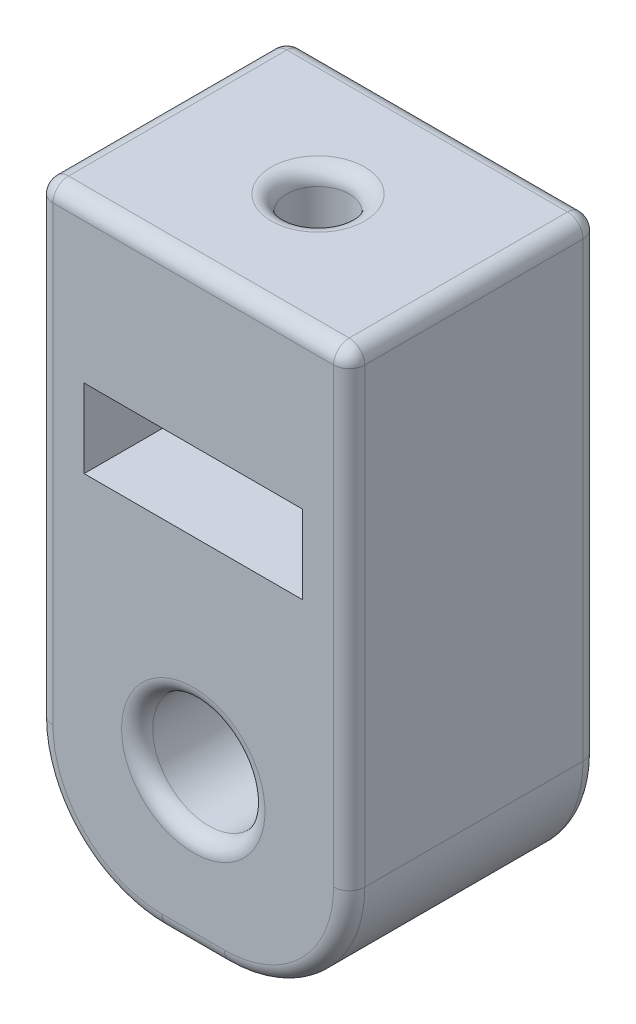
ISO-10303-21;
HEADER;
FILE_DESCRIPTION(('STEP AP214'),'2;1');
FILE_NAME('part.step','',(''),(''),'','','');
FILE_SCHEMA(('AUTOMOTIVE_DESIGN { 1 0 10303 214 1 1 1 1 }'));
ENDSEC;
DATA;
#1=APPLICATION_CONTEXT('core data for automotive mechanical design processes');
#2=APPLICATION_PROTOCOL_DEFINITION('international standard','automotive_design',2000,#1);
#3=PRODUCT_CONTEXT('',#1,'mechanical');
#4=PRODUCT('Part','Part','',(#3));
#5=PRODUCT_RELATED_PRODUCT_CATEGORY('part','',(#4));
#6=PRODUCT_DEFINITION_FORMATION('','',#4);
#7=PRODUCT_DEFINITION_CONTEXT('part definition',#1,'design');
#8=PRODUCT_DEFINITION('design','',#6,#7);
#9=PRODUCT_DEFINITION_SHAPE('','',#8);
#10=(LENGTH_UNIT() NAMED_UNIT(*) SI_UNIT(.MILLI.,.METRE.));
#11=(NAMED_UNIT(*) PLANE_ANGLE_UNIT() SI_UNIT($,.RADIAN.));
#12=(NAMED_UNIT(*) SI_UNIT($,.STERADIAN.) SOLID_ANGLE_UNIT());
#13=UNCERTAINTY_MEASURE_WITH_UNIT(LENGTH_MEASURE(1.E-05),#10,'distance_accuracy_value','');
#14=(GEOMETRIC_REPRESENTATION_CONTEXT(3) GLOBAL_UNCERTAINTY_ASSIGNED_CONTEXT((#13)) GLOBAL_UNIT_ASSIGNED_CONTEXT((#10,
#11,#12)) REPRESENTATION_CONTEXT('',''));
#15=CARTESIAN_POINT('',(0.,0.,0.));
#16=DIRECTION('',(0.,0.,1.));
#17=DIRECTION('',(1.,0.,0.));
#18=AXIS2_PLACEMENT_3D('',#15,#16,#17);
#19=CARTESIAN_POINT('',(6.35,8.89,5.08));
#20=DIRECTION('',(0.,1.,0.));
#21=DIRECTION('',(0.,0.,1.));
#22=AXIS2_PLACEMENT_3D('',#19,#20,#21);
#23=CYLINDRICAL_SURFACE('',#22,1.27);
#24=CARTESIAN_POINT('',(6.35,17.78,5.08));
#25=DIRECTION('',(0.,1.,0.));
#26=DIRECTION('',(0.,0.,1.));
#27=AXIS2_PLACEMENT_3D('',#24,#25,#26);
#28=CIRCLE('',#27,1.27);
#29=CARTESIAN_POINT('',(6.35,17.78,6.35));
#30=VERTEX_POINT('',#29);
#31=EDGE_CURVE('E46',#30,#30,#28,.F.);
#32=CARTESIAN_POINT('',(6.35,23.495,5.08));
#33=DIRECTION('',(0.,-1.,0.));
#34=DIRECTION('',(0.,0.,-1.));
#35=AXIS2_PLACEMENT_3D('',#32,#33,#34);
#36=CIRCLE('',#35,1.27);
#37=CARTESIAN_POINT('',(6.35,23.495,6.35));
#38=VERTEX_POINT('',#37);
#39=EDGE_CURVE('E326',#38,#38,#36,.F.);
#40=CARTESIAN_POINT('',(6.35,17.78,6.35));
#41=CARTESIAN_POINT('',(6.35,17.83953125,6.35));
#42=CARTESIAN_POINT('',(6.35,17.8990625,6.35));
#43=CARTESIAN_POINT('',(6.35,18.018125,6.35));
#44=CARTESIAN_POINT('',(6.35,18.07765625,6.35));
#45=CARTESIAN_POINT('',(6.35,18.19671875,6.35));
#46=CARTESIAN_POINT('',(6.35,18.25625,6.35));
#47=CARTESIAN_POINT('',(6.35,18.3753125,6.35));
#48=CARTESIAN_POINT('',(6.35,18.43484375,6.35));
#49=CARTESIAN_POINT('',(6.35,18.55390625,6.35));
#50=CARTESIAN_POINT('',(6.35,18.6134375,6.35));
#51=CARTESIAN_POINT('',(6.35,18.7325,6.35));
#52=CARTESIAN_POINT('',(6.35,18.79203125,6.35));
#53=CARTESIAN_POINT('',(6.35,18.91109375,6.35));
#54=CARTESIAN_POINT('',(6.35,18.970625,6.35));
#55=CARTESIAN_POINT('',(6.35,19.0896875,6.35));
#56=CARTESIAN_POINT('',(6.35,19.14921875,6.35));
#57=CARTESIAN_POINT('',(6.35,19.26828125,6.35));
#58=CARTESIAN_POINT('',(6.35,19.3278125,6.35));
#59=CARTESIAN_POINT('',(6.35,19.446875,6.35));
#60=CARTESIAN_POINT('',(6.35,19.50640625,6.35));
#61=CARTESIAN_POINT('',(6.35,19.62546875,6.35));
#62=CARTESIAN_POINT('',(6.35,19.685,6.35));
#63=CARTESIAN_POINT('',(6.35,19.8040625,6.35));
#64=CARTESIAN_POINT('',(6.35,19.86359375,6.35));
#65=CARTESIAN_POINT('',(6.35,19.98265625,6.35));
#66=CARTESIAN_POINT('',(6.35,20.0421875,6.35));
#67=CARTESIAN_POINT('',(6.35,20.16125,6.35));
#68=CARTESIAN_POINT('',(6.35,20.22078125,6.35));
#69=CARTESIAN_POINT('',(6.35,20.33984375,6.35));
#70=CARTESIAN_POINT('',(6.35,20.399375,6.35));
#71=CARTESIAN_POINT('',(6.35,20.5184375,6.35));
#72=CARTESIAN_POINT('',(6.35,20.57796875,6.35));
#73=CARTESIAN_POINT('',(6.35,20.69703125,6.35));
#74=CARTESIAN_POINT('',(6.35,20.7565625,6.35));
#75=CARTESIAN_POINT('',(6.35,20.875625,6.35));
#76=CARTESIAN_POINT('',(6.35,20.93515625,6.35));
#77=CARTESIAN_POINT('',(6.35,21.05421875,6.35));
#78=CARTESIAN_POINT('',(6.35,21.11375,6.35));
#79=CARTESIAN_POINT('',(6.35,21.2328125,6.35));
#80=CARTESIAN_POINT('',(6.35,21.29234375,6.35));
#81=CARTESIAN_POINT('',(6.35,21.41140625,6.35));
#82=CARTESIAN_POINT('',(6.35,21.4709375,6.35));
#83=CARTESIAN_POINT('',(6.35,21.59,6.35));
#84=CARTESIAN_POINT('',(6.35,21.64953125,6.35));
#85=CARTESIAN_POINT('',(6.35,21.76859375,6.35));
#86=CARTESIAN_POINT('',(6.35,21.828125,6.35));
#87=CARTESIAN_POINT('',(6.35,21.9471875,6.35));
#88=CARTESIAN_POINT('',(6.35,22.00671875,6.35));
#89=CARTESIAN_POINT('',(6.35,22.12578125,6.35));
#90=CARTESIAN_POINT('',(6.35,22.1853125,6.35));
#91=CARTESIAN_POINT('',(6.35,22.304375,6.35));
#92=CARTESIAN_POINT('',(6.35,22.36390625,6.35));
#93=CARTESIAN_POINT('',(6.35,22.48296875,6.35));
#94=CARTESIAN_POINT('',(6.35,22.5425,6.35));
#95=CARTESIAN_POINT('',(6.35,22.6615625,6.35));
#96=CARTESIAN_POINT('',(6.35,22.72109375,6.35));
#97=CARTESIAN_POINT('',(6.35,22.84015625,6.35));
#98=CARTESIAN_POINT('',(6.35,22.8996875,6.35));
#99=CARTESIAN_POINT('',(6.35,23.01875,6.35));
#100=CARTESIAN_POINT('',(6.35,23.07828125,6.35));
#101=CARTESIAN_POINT('',(6.35,23.19734375,6.35));
#102=CARTESIAN_POINT('',(6.35,23.256875,6.35));
#103=CARTESIAN_POINT('',(6.35,23.3759375,6.35));
#104=CARTESIAN_POINT('',(6.35,23.43546875,6.35));
#105=CARTESIAN_POINT('',(6.35,23.495,6.35));
#106=B_SPLINE_CURVE_WITH_KNOTS('',3,(#40,#41,#42,#43,#44,#45,#46,#47,#48,#49,#50,#51,#52,#53,
#54,#55,#56,#57,#58,#59,#60,#61,#62,#63,#64,#65,#66,#67,#68,#69,#70,#71,#72,#73,#74,#75,#76,#77,
#78,#79,#80,#81,#82,#83,#84,#85,#86,#87,#88,#89,#90,#91,#92,#93,#94,#95,#96,#97,#98,#99,#100,
#101,#102,#103,#104,#105),.UNSPECIFIED.,.F.,.F.,(4,2,2,2,2,2,2,2,2,2,2,2,2,2,2,2,2,2,2,2,2,2,2,
2,2,2,2,2,2,2,2,2,4),(0.,0.178593750000001,0.357187499999998,0.535781250000002,0.714375,
0.892968750000001,1.0715625,1.25015625,1.42875,1.60734375,1.7859375,1.96453125,2.143125,
2.32171875,2.5003125,2.67890625,2.8575,3.03609375,3.2146875,3.39328125,3.571875,3.75046875,
3.9290625,4.10765625,4.28625,4.46484375,4.6434375,4.82203125,5.000625,5.17921875,
5.35781250000001,5.53640625,5.71500000000001),.UNSPECIFIED.);
#107=EDGE_CURVE('BSEAM42',#30,#38,#106,.T.);
#108=ORIENTED_EDGE('',*,*,#31,.T.);
#109=ORIENTED_EDGE('',*,*,#39,.T.);
#110=ORIENTED_EDGE('',*,*,#107,.T.);
#111=ORIENTED_EDGE('',*,*,#107,.F.);
#112=EDGE_LOOP('',(#108,#110,#109,#111));
#113=FACE_BOUND('',#112,.T.);
#114=ADVANCED_FACE('F42',(#113),#23,.F.);
#115=CARTESIAN_POINT('',(0.,0.,10.16));
#116=DIRECTION('',(0.,0.,-1.));
#117=DIRECTION('',(-1.,0.,0.));
#118=AXIS2_PLACEMENT_3D('',#115,#116,#117);
#119=PLANE('',#118);
#120=DIRECTION('',(1.,0.,0.));
#121=VECTOR('',#120,1.);
#122=CARTESIAN_POINT('',(10.795,17.78,10.16));
#123=LINE('',#122,#121);
#124=CARTESIAN_POINT('',(1.905,17.78,10.16));
#125=VERTEX_POINT('',#124);
#126=CARTESIAN_POINT('',(10.795,17.78,10.16));
#127=VERTEX_POINT('',#126);
#128=EDGE_CURVE('E179',#125,#127,#123,.T.);
#129=ORIENTED_EDGE('',*,*,#128,.T.);
#130=DIRECTION('',(0.,-1.,0.));
#131=VECTOR('',#130,1.);
#132=CARTESIAN_POINT('',(10.795,17.78,10.16));
#133=LINE('',#132,#131);
#134=CARTESIAN_POINT('',(10.795,14.58468,10.16));
#135=VERTEX_POINT('',#134);
#136=EDGE_CURVE('E172',#127,#135,#133,.T.);
#137=ORIENTED_EDGE('',*,*,#136,.T.);
#138=DIRECTION('',(-1.,0.,0.));
#139=VECTOR('',#138,1.);
#140=CARTESIAN_POINT('',(10.795,14.58468,10.16));
#141=LINE('',#140,#139);
#142=CARTESIAN_POINT('',(1.905,14.58468,10.16));
#143=VERTEX_POINT('',#142);
#144=EDGE_CURVE('E182',#135,#143,#141,.T.);
#145=ORIENTED_EDGE('',*,*,#144,.T.);
#146=DIRECTION('',(0.,1.,0.));
#147=VECTOR('',#146,1.);
#148=CARTESIAN_POINT('',(1.905,17.78,10.16));
#149=LINE('',#148,#147);
#150=EDGE_CURVE('E60',#143,#125,#149,.T.);
#151=ORIENTED_EDGE('',*,*,#150,.T.);
#152=EDGE_LOOP('',(#129,#137,#145,#151));
#153=FACE_BOUND('',#152,.T.);
#154=CARTESIAN_POINT('',(6.35,6.35,10.16));
#155=DIRECTION('',(0.,0.,-1.));
#156=DIRECTION('',(-1.,0.,0.));
#157=AXIS2_PLACEMENT_3D('',#154,#155,#156);
#158=CIRCLE('',#157,2.921);
#159=CARTESIAN_POINT('',(3.429,6.35,10.16));
#160=VERTEX_POINT('',#159);
#161=EDGE_CURVE('E11',#160,#160,#158,.T.);
#162=ORIENTED_EDGE('',*,*,#161,.T.);
#163=EDGE_LOOP('',(#162));
#164=FACE_BOUND('',#163,.T.);
#165=DIRECTION('',(0.,-1.,0.));
#166=VECTOR('',#165,1.);
#167=CARTESIAN_POINT('',(0.635,0.,10.16));
#168=LINE('',#167,#166);
#169=CARTESIAN_POINT('',(0.635,23.495,10.16));
#170=VERTEX_POINT('',#169);
#171=CARTESIAN_POINT('',(0.635,5.08,10.16));
#172=VERTEX_POINT('',#171);
#173=EDGE_CURVE('E342',#170,#172,#168,.T.);
#174=ORIENTED_EDGE('',*,*,#173,.T.);
#175=CARTESIAN_POINT('',(5.08,5.08,10.16));
#176=DIRECTION('',(0.,0.,-1.));
#177=DIRECTION('',(-1.,0.,0.));
#178=AXIS2_PLACEMENT_3D('',#175,#176,#177);
#179=CIRCLE('',#178,4.445);
#180=CARTESIAN_POINT('',(5.08,0.635,10.16));
#181=VERTEX_POINT('',#180);
#182=EDGE_CURVE('E52',#172,#181,#179,.F.);
#183=ORIENTED_EDGE('',*,*,#182,.T.);
#184=DIRECTION('',(1.,0.,0.));
#185=VECTOR('',#184,1.);
#186=CARTESIAN_POINT('',(0.,0.635,10.16));
#187=LINE('',#186,#185);
#188=CARTESIAN_POINT('',(7.62,0.635,10.16));
#189=VERTEX_POINT('',#188);
#190=EDGE_CURVE('E330',#181,#189,#187,.T.);
#191=ORIENTED_EDGE('',*,*,#190,.T.);
#192=CARTESIAN_POINT('',(7.62,5.08,10.16));
#193=DIRECTION('',(0.,0.,-1.));
#194=DIRECTION('',(-1.,0.,0.));
#195=AXIS2_PLACEMENT_3D('',#192,#193,#194);
#196=CIRCLE('',#195,4.445);
#197=CARTESIAN_POINT('',(12.065,5.08,10.16));
#198=VERTEX_POINT('',#197);
#199=EDGE_CURVE('E333',#189,#198,#196,.F.);
#200=ORIENTED_EDGE('',*,*,#199,.T.);
#201=DIRECTION('',(0.,1.,0.));
#202=VECTOR('',#201,1.);
#203=CARTESIAN_POINT('',(12.065,0.,10.16));
#204=LINE('',#203,#202);
#205=CARTESIAN_POINT('',(12.065,23.495,10.16));
#206=VERTEX_POINT('',#205);
#207=EDGE_CURVE('E336',#198,#206,#204,.T.);
#208=ORIENTED_EDGE('',*,*,#207,.T.);
#209=DIRECTION('',(-1.,0.,0.));
#210=VECTOR('',#209,1.);
#211=CARTESIAN_POINT('',(0.,23.495,10.16));
#212=LINE('',#211,#210);
#213=EDGE_CURVE('E339',#206,#170,#212,.T.);
#214=ORIENTED_EDGE('',*,*,#213,.T.);
#215=EDGE_LOOP('',(#174,#183,#191,#200,#208,#214));
#216=FACE_BOUND('',#215,.T.);
#217=ADVANCED_FACE('F188',(#153,#164,#216),#119,.F.);
#218=CARTESIAN_POINT('',(0.,0.,0.));
#219=DIRECTION('',(0.,0.,-1.));
#220=DIRECTION('',(-1.,0.,0.));
#221=AXIS2_PLACEMENT_3D('',#218,#219,#220);
#222=PLANE('',#221);
#223=DIRECTION('',(0.,-1.,0.));
#224=VECTOR('',#223,1.);
#225=CARTESIAN_POINT('',(10.795,17.78,0.));
#226=LINE('',#225,#224);
#227=CARTESIAN_POINT('',(10.795,17.78,0.));
#228=VERTEX_POINT('',#227);
#229=CARTESIAN_POINT('',(10.795,14.58468,0.));
#230=VERTEX_POINT('',#229);
#231=EDGE_CURVE('E68',#228,#230,#226,.T.);
#232=ORIENTED_EDGE('',*,*,#231,.F.);
#233=DIRECTION('',(1.,0.,0.));
#234=VECTOR('',#233,1.);
#235=CARTESIAN_POINT('',(10.795,17.78,0.));
#236=LINE('',#235,#234);
#237=CARTESIAN_POINT('',(1.905,17.78,0.));
#238=VERTEX_POINT('',#237);
#239=EDGE_CURVE('E192',#238,#228,#236,.T.);
#240=ORIENTED_EDGE('',*,*,#239,.F.);
#241=DIRECTION('',(0.,1.,0.));
#242=VECTOR('',#241,1.);
#243=CARTESIAN_POINT('',(1.905,17.78,0.));
#244=LINE('',#243,#242);
#245=CARTESIAN_POINT('',(1.905,14.58468,0.));
#246=VERTEX_POINT('',#245);
#247=EDGE_CURVE('E196',#246,#238,#244,.T.);
#248=ORIENTED_EDGE('',*,*,#247,.F.);
#249=DIRECTION('',(-1.,0.,0.));
#250=VECTOR('',#249,1.);
#251=CARTESIAN_POINT('',(10.795,14.58468,0.));
#252=LINE('',#251,#250);
#253=EDGE_CURVE('E205',#230,#246,#252,.T.);
#254=ORIENTED_EDGE('',*,*,#253,.F.);
#255=EDGE_LOOP('',(#232,#240,#248,#254));
#256=FACE_BOUND('',#255,.T.);
#257=CARTESIAN_POINT('',(6.35,6.35,0.));
#258=DIRECTION('',(0.,0.,-1.));
#259=DIRECTION('',(-1.,0.,0.));
#260=AXIS2_PLACEMENT_3D('',#257,#258,#259);
#261=CIRCLE('',#260,2.921);
#262=CARTESIAN_POINT('',(3.429,6.35,0.));
#263=VERTEX_POINT('',#262);
#264=EDGE_CURVE('E260',#263,#263,#261,.F.);
#265=ORIENTED_EDGE('',*,*,#264,.T.);
#266=EDGE_LOOP('',(#265));
#267=FACE_BOUND('',#266,.T.);
#268=CARTESIAN_POINT('',(5.08,5.08,0.));
#269=DIRECTION('',(0.,0.,-1.));
#270=DIRECTION('',(-1.,0.,0.));
#271=AXIS2_PLACEMENT_3D('',#268,#269,#270);
#272=CIRCLE('',#271,4.445);
#273=CARTESIAN_POINT('',(5.08,0.635,0.));
#274=VERTEX_POINT('',#273);
#275=CARTESIAN_POINT('',(0.635,5.08,0.));
#276=VERTEX_POINT('',#275);
#277=EDGE_CURVE('E253',#274,#276,#272,.T.);
#278=ORIENTED_EDGE('',*,*,#277,.T.);
#279=DIRECTION('',(0.,-1.,0.));
#280=VECTOR('',#279,1.);
#281=CARTESIAN_POINT('',(0.635,24.13,0.));
#282=LINE('',#281,#280);
#283=CARTESIAN_POINT('',(0.635,23.495,0.));
#284=VERTEX_POINT('',#283);
#285=EDGE_CURVE('E256',#276,#284,#282,.F.);
#286=ORIENTED_EDGE('',*,*,#285,.T.);
#287=DIRECTION('',(-1.,0.,0.));
#288=VECTOR('',#287,1.);
#289=CARTESIAN_POINT('',(12.7,23.495,0.));
#290=LINE('',#289,#288);
#291=CARTESIAN_POINT('',(12.065,23.495,0.));
#292=VERTEX_POINT('',#291);
#293=EDGE_CURVE('E241',#284,#292,#290,.F.);
#294=ORIENTED_EDGE('',*,*,#293,.T.);
#295=DIRECTION('',(0.,1.,0.));
#296=VECTOR('',#295,1.);
#297=CARTESIAN_POINT('',(12.065,5.08,0.));
#298=LINE('',#297,#296);
#299=CARTESIAN_POINT('',(12.065,5.08,0.));
#300=VERTEX_POINT('',#299);
#301=EDGE_CURVE('E244',#292,#300,#298,.F.);
#302=ORIENTED_EDGE('',*,*,#301,.T.);
#303=CARTESIAN_POINT('',(7.62,5.08,0.));
#304=DIRECTION('',(0.,0.,-1.));
#305=DIRECTION('',(-1.,0.,0.));
#306=AXIS2_PLACEMENT_3D('',#303,#304,#305);
#307=CIRCLE('',#306,4.445);
#308=CARTESIAN_POINT('',(7.62,0.635,0.));
#309=VERTEX_POINT('',#308);
#310=EDGE_CURVE('E247',#300,#309,#307,.T.);
#311=ORIENTED_EDGE('',*,*,#310,.T.);
#312=DIRECTION('',(1.,0.,0.));
#313=VECTOR('',#312,1.);
#314=CARTESIAN_POINT('',(5.08,0.635,0.));
#315=LINE('',#314,#313);
#316=EDGE_CURVE('E250',#309,#274,#315,.F.);
#317=ORIENTED_EDGE('',*,*,#316,.T.);
#318=EDGE_LOOP('',(#278,#286,#294,#302,#311,#317));
#319=FACE_BOUND('',#318,.T.);
#320=ADVANCED_FACE('F451',(#256,#267,#319),#222,.T.);
#321=CARTESIAN_POINT('',(0.,0.,10.16));
#322=DIRECTION('',(1.,0.,0.));
#323=DIRECTION('',(0.,0.,-1.));
#324=AXIS2_PLACEMENT_3D('',#321,#322,#323);
#325=PLANE('',#324);
#326=DIRECTION('',(0.,0.,-1.));
#327=VECTOR('',#326,1.);
#328=CARTESIAN_POINT('',(0.,23.495,10.16));
#329=LINE('',#328,#327);
#330=CARTESIAN_POINT('',(0.,23.495,9.525));
#331=VERTEX_POINT('',#330);
#332=CARTESIAN_POINT('',(0.,23.495,0.635));
#333=VERTEX_POINT('',#332);
#334=EDGE_CURVE('E275',#331,#333,#329,.T.);
#335=ORIENTED_EDGE('',*,*,#334,.T.);
#336=DIRECTION('',(0.,-1.,0.));
#337=VECTOR('',#336,1.);
#338=CARTESIAN_POINT('',(0.,5.08,0.635));
#339=LINE('',#338,#337);
#340=CARTESIAN_POINT('',(0.,5.08,0.635));
#341=VERTEX_POINT('',#340);
#342=EDGE_CURVE('E278',#333,#341,#339,.T.);
#343=ORIENTED_EDGE('',*,*,#342,.T.);
#344=DIRECTION('',(0.,0.,-1.));
#345=VECTOR('',#344,1.);
#346=CARTESIAN_POINT('',(0.,5.08,10.16));
#347=LINE('',#346,#345);
#348=CARTESIAN_POINT('',(0.,5.08,9.525));
#349=VERTEX_POINT('',#348);
#350=EDGE_CURVE('E237',#341,#349,#347,.F.);
#351=ORIENTED_EDGE('',*,*,#350,.T.);
#352=DIRECTION('',(0.,-1.,0.));
#353=VECTOR('',#352,1.);
#354=CARTESIAN_POINT('',(0.,0.,9.525));
#355=LINE('',#354,#353);
#356=EDGE_CURVE('E272',#349,#331,#355,.F.);
#357=ORIENTED_EDGE('',*,*,#356,.T.);
#358=EDGE_LOOP('',(#335,#343,#351,#357));
#359=FACE_BOUND('',#358,.T.);
#360=ADVANCED_FACE('F776',(#359),#325,.F.);
#361=CARTESIAN_POINT('',(0.,0.,10.16));
#362=DIRECTION('',(0.,1.,0.));
#363=DIRECTION('',(0.,0.,1.));
#364=AXIS2_PLACEMENT_3D('',#361,#362,#363);
#365=PLANE('',#364);
#366=DIRECTION('',(0.,0.,-1.));
#367=VECTOR('',#366,1.);
#368=CARTESIAN_POINT('',(5.08,0.,10.16));
#369=LINE('',#368,#367);
#370=CARTESIAN_POINT('',(5.08,0.,9.525));
#371=VERTEX_POINT('',#370);
#372=CARTESIAN_POINT('',(5.08,0.,0.635));
#373=VERTEX_POINT('',#372);
#374=EDGE_CURVE('E229',#371,#373,#369,.T.);
#375=ORIENTED_EDGE('',*,*,#374,.T.);
#376=DIRECTION('',(1.,0.,0.));
#377=VECTOR('',#376,1.);
#378=CARTESIAN_POINT('',(7.62,0.,0.635));
#379=LINE('',#378,#377);
#380=CARTESIAN_POINT('',(7.62,0.,0.635));
#381=VERTEX_POINT('',#380);
#382=EDGE_CURVE('E291',#373,#381,#379,.T.);
#383=ORIENTED_EDGE('',*,*,#382,.T.);
#384=DIRECTION('',(0.,0.,-1.));
#385=VECTOR('',#384,1.);
#386=CARTESIAN_POINT('',(7.62,0.,10.16));
#387=LINE('',#386,#385);
#388=CARTESIAN_POINT('',(7.62,0.,9.525));
#389=VERTEX_POINT('',#388);
#390=EDGE_CURVE('E233',#381,#389,#387,.F.);
#391=ORIENTED_EDGE('',*,*,#390,.T.);
#392=DIRECTION('',(1.,0.,0.));
#393=VECTOR('',#392,1.);
#394=CARTESIAN_POINT('',(0.,0.,9.525));
#395=LINE('',#394,#393);
#396=EDGE_CURVE('E288',#389,#371,#395,.F.);
#397=ORIENTED_EDGE('',*,*,#396,.T.);
#398=EDGE_LOOP('',(#375,#383,#391,#397));
#399=FACE_BOUND('',#398,.T.);
#400=ADVANCED_FACE('F797',(#399),#365,.F.);
#401=CARTESIAN_POINT('',(12.7,0.,10.16));
#402=DIRECTION('',(-1.,0.,0.));
#403=DIRECTION('',(0.,0.,1.));
#404=AXIS2_PLACEMENT_3D('',#401,#402,#403);
#405=PLANE('',#404);
#406=DIRECTION('',(0.,0.,-1.));
#407=VECTOR('',#406,1.);
#408=CARTESIAN_POINT('',(12.7,5.08,10.16));
#409=LINE('',#408,#407);
#410=CARTESIAN_POINT('',(12.7,5.08,9.525));
#411=VERTEX_POINT('',#410);
#412=CARTESIAN_POINT('',(12.7,5.08,0.635));
#413=VERTEX_POINT('',#412);
#414=EDGE_CURVE('E224',#411,#413,#409,.T.);
#415=ORIENTED_EDGE('',*,*,#414,.T.);
#416=DIRECTION('',(0.,1.,0.));
#417=VECTOR('',#416,1.);
#418=CARTESIAN_POINT('',(12.7,24.13,0.635));
#419=LINE('',#418,#417);
#420=CARTESIAN_POINT('',(12.7,23.495,0.635));
#421=VERTEX_POINT('',#420);
#422=EDGE_CURVE('E306',#413,#421,#419,.T.);
#423=ORIENTED_EDGE('',*,*,#422,.T.);
#424=DIRECTION('',(0.,0.,-1.));
#425=VECTOR('',#424,1.);
#426=CARTESIAN_POINT('',(12.7,23.495,10.16));
#427=LINE('',#426,#425);
#428=CARTESIAN_POINT('',(12.7,23.495,9.525));
#429=VERTEX_POINT('',#428);
#430=EDGE_CURVE('E303',#421,#429,#427,.F.);
#431=ORIENTED_EDGE('',*,*,#430,.T.);
#432=DIRECTION('',(0.,1.,0.));
#433=VECTOR('',#432,1.);
#434=CARTESIAN_POINT('',(12.7,0.,9.525));
#435=LINE('',#434,#433);
#436=EDGE_CURVE('E300',#429,#411,#435,.F.);
#437=ORIENTED_EDGE('',*,*,#436,.T.);
#438=EDGE_LOOP('',(#415,#423,#431,#437));
#439=FACE_BOUND('',#438,.T.);
#440=ADVANCED_FACE('F806',(#439),#405,.F.);
#441=CARTESIAN_POINT('',(0.,24.13,10.16));
#442=DIRECTION('',(0.,-1.,0.));
#443=DIRECTION('',(0.,0.,-1.));
#444=AXIS2_PLACEMENT_3D('',#441,#442,#443);
#445=PLANE('',#444);
#446=CARTESIAN_POINT('',(6.35,24.13,5.08));
#447=DIRECTION('',(0.,-1.,0.));
#448=DIRECTION('',(0.,0.,-1.));
#449=AXIS2_PLACEMENT_3D('',#446,#447,#448);
#450=CIRCLE('',#449,1.905);
#451=CARTESIAN_POINT('',(6.35,24.13,3.175));
#452=VERTEX_POINT('',#451);
#453=EDGE_CURVE('E322',#452,#452,#450,.T.);
#454=ORIENTED_EDGE('',*,*,#453,.T.);
#455=EDGE_LOOP('',(#454));
#456=FACE_BOUND('',#455,.T.);
#457=DIRECTION('',(0.,0.,-1.));
#458=VECTOR('',#457,1.);
#459=CARTESIAN_POINT('',(12.065,24.13,10.16));
#460=LINE('',#459,#458);
#461=CARTESIAN_POINT('',(12.065,24.13,9.525));
#462=VERTEX_POINT('',#461);
#463=CARTESIAN_POINT('',(12.065,24.13,0.635));
#464=VERTEX_POINT('',#463);
#465=EDGE_CURVE('E315',#462,#464,#460,.T.);
#466=ORIENTED_EDGE('',*,*,#465,.T.);
#467=DIRECTION('',(-1.,0.,0.));
#468=VECTOR('',#467,1.);
#469=CARTESIAN_POINT('',(0.,24.13,0.635));
#470=LINE('',#469,#468);
#471=CARTESIAN_POINT('',(0.635,24.13,0.635));
#472=VERTEX_POINT('',#471);
#473=EDGE_CURVE('E319',#464,#472,#470,.T.);
#474=ORIENTED_EDGE('',*,*,#473,.T.);
#475=DIRECTION('',(0.,0.,-1.));
#476=VECTOR('',#475,1.);
#477=CARTESIAN_POINT('',(0.635,24.13,10.16));
#478=LINE('',#477,#476);
#479=CARTESIAN_POINT('',(0.635,24.13,9.525));
#480=VERTEX_POINT('',#479);
#481=EDGE_CURVE('E312',#472,#480,#478,.F.);
#482=ORIENTED_EDGE('',*,*,#481,.T.);
#483=DIRECTION('',(-1.,0.,0.));
#484=VECTOR('',#483,1.);
#485=CARTESIAN_POINT('',(0.,24.13,9.525));
#486=LINE('',#485,#484);
#487=EDGE_CURVE('E309',#480,#462,#486,.F.);
#488=ORIENTED_EDGE('',*,*,#487,.T.);
#489=EDGE_LOOP('',(#466,#474,#482,#488));
#490=FACE_BOUND('',#489,.T.);
#491=ADVANCED_FACE('F816',(#456,#490),#445,.F.);
#492=CARTESIAN_POINT('',(6.35,6.35,10.16));
#493=DIRECTION('',(0.,0.,-1.));
#494=DIRECTION('',(-1.,0.,0.));
#495=AXIS2_PLACEMENT_3D('',#492,#493,#494);
#496=CYLINDRICAL_SURFACE('',#495,2.286);
#497=CARTESIAN_POINT('',(6.35,6.35,0.635));
#498=DIRECTION('',(0.,0.,-1.));
#499=DIRECTION('',(-1.,0.,0.));
#500=AXIS2_PLACEMENT_3D('',#497,#498,#499);
#501=CIRCLE('',#500,2.286);
#502=CARTESIAN_POINT('',(4.064,6.35,0.635));
#503=VERTEX_POINT('',#502);
#504=EDGE_CURVE('E268',#503,#503,#501,.T.);
#505=ORIENTED_EDGE('',*,*,#504,.T.);
#506=EDGE_LOOP('',(#505));
#507=FACE_BOUND('',#506,.T.);
#508=CARTESIAN_POINT('',(6.35,6.35,9.525));
#509=DIRECTION('',(0.,0.,-1.));
#510=DIRECTION('',(-1.,0.,0.));
#511=AXIS2_PLACEMENT_3D('',#508,#509,#510);
#512=CIRCLE('',#511,2.286);
#513=CARTESIAN_POINT('',(4.064,6.35,9.525));
#514=VERTEX_POINT('',#513);
#515=EDGE_CURVE('E264',#514,#514,#512,.F.);
#516=ORIENTED_EDGE('',*,*,#515,.T.);
#517=EDGE_LOOP('',(#516));
#518=FACE_BOUND('',#517,.T.);
#519=ADVANCED_FACE('F492',(#507,#518),#496,.F.);
#520=CARTESIAN_POINT('',(7.62,5.08,10.16));
#521=DIRECTION('',(0.,0.,-1.));
#522=DIRECTION('',(-1.,0.,0.));
#523=AXIS2_PLACEMENT_3D('',#520,#521,#522);
#524=CYLINDRICAL_SURFACE('',#523,5.08);
#525=ORIENTED_EDGE('',*,*,#390,.F.);
#526=CARTESIAN_POINT('',(7.62,5.08,0.635));
#527=DIRECTION('',(0.,0.,-1.));
#528=DIRECTION('',(-1.,0.,0.));
#529=AXIS2_PLACEMENT_3D('',#526,#527,#528);
#530=CIRCLE('',#529,5.08);
#531=EDGE_CURVE('E297',#381,#413,#530,.F.);
#532=ORIENTED_EDGE('',*,*,#531,.T.);
#533=ORIENTED_EDGE('',*,*,#414,.F.);
#534=CARTESIAN_POINT('',(7.62,5.08,9.525));
#535=DIRECTION('',(0.,0.,-1.));
#536=DIRECTION('',(-1.,0.,0.));
#537=AXIS2_PLACEMENT_3D('',#534,#535,#536);
#538=CIRCLE('',#537,5.08);
#539=EDGE_CURVE('E294',#411,#389,#538,.T.);
#540=ORIENTED_EDGE('',*,*,#539,.T.);
#541=EDGE_LOOP('',(#525,#532,#533,#540));
#542=FACE_BOUND('',#541,.T.);
#543=ADVANCED_FACE('F504',(#542),#524,.T.);
#544=CARTESIAN_POINT('',(5.08,5.08,10.16));
#545=DIRECTION('',(0.,0.,-1.));
#546=DIRECTION('',(-1.,0.,0.));
#547=AXIS2_PLACEMENT_3D('',#544,#545,#546);
#548=CYLINDRICAL_SURFACE('',#547,5.08);
#549=ORIENTED_EDGE('',*,*,#350,.F.);
#550=CARTESIAN_POINT('',(5.08,5.08,0.635));
#551=DIRECTION('',(0.,0.,-1.));
#552=DIRECTION('',(-1.,0.,0.));
#553=AXIS2_PLACEMENT_3D('',#550,#551,#552);
#554=CIRCLE('',#553,5.08);
#555=EDGE_CURVE('E285',#341,#373,#554,.F.);
#556=ORIENTED_EDGE('',*,*,#555,.T.);
#557=ORIENTED_EDGE('',*,*,#374,.F.);
#558=CARTESIAN_POINT('',(5.08,5.08,9.525));
#559=DIRECTION('',(0.,0.,-1.));
#560=DIRECTION('',(-1.,0.,0.));
#561=AXIS2_PLACEMENT_3D('',#558,#559,#560);
#562=CIRCLE('',#561,5.08);
#563=EDGE_CURVE('E282',#371,#349,#562,.T.);
#564=ORIENTED_EDGE('',*,*,#563,.T.);
#565=EDGE_LOOP('',(#549,#556,#557,#564));
#566=FACE_BOUND('',#565,.T.);
#567=ADVANCED_FACE('F510',(#566),#548,.T.);
#568=CARTESIAN_POINT('',(6.35,6.35,0.635));
#569=DIRECTION('',(0.,0.,-1.));
#570=DIRECTION('',(-1.,0.,0.));
#571=AXIS2_PLACEMENT_3D('',#568,#569,#570);
#572=TOROIDAL_SURFACE('',#571,2.921,0.635);
#573=ORIENTED_EDGE('',*,*,#504,.F.);
#574=EDGE_LOOP('',(#573));
#575=FACE_BOUND('',#574,.T.);
#576=ORIENTED_EDGE('',*,*,#264,.F.);
#577=EDGE_LOOP('',(#576));
#578=FACE_BOUND('',#577,.T.);
#579=ADVANCED_FACE('F521',(#575,#578),#572,.T.);
#580=CARTESIAN_POINT('',(7.62,5.08,9.525));
#581=DIRECTION('',(0.,0.,-1.));
#582=DIRECTION('',(-1.,0.,0.));
#583=AXIS2_PLACEMENT_3D('',#580,#581,#582);
#584=TOROIDAL_SURFACE('',#583,4.445,0.635);
#585=CARTESIAN_POINT('',(7.62,0.635,9.525));
#586=DIRECTION('',(-1.,0.,0.));
#587=DIRECTION('',(0.,0.,1.));
#588=AXIS2_PLACEMENT_3D('',#585,#586,#587);
#589=CIRCLE('',#588,0.635);
#590=EDGE_CURVE('E417',#389,#189,#589,.T.);
#591=ORIENTED_EDGE('',*,*,#590,.F.);
#592=ORIENTED_EDGE('',*,*,#539,.F.);
#593=CARTESIAN_POINT('',(12.065,5.08,9.525));
#594=DIRECTION('',(0.,1.,0.));
#595=DIRECTION('',(0.,0.,1.));
#596=AXIS2_PLACEMENT_3D('',#593,#594,#595);
#597=CIRCLE('',#596,0.635);
#598=EDGE_CURVE('E225',#198,#411,#597,.T.);
#599=ORIENTED_EDGE('',*,*,#598,.F.);
#600=ORIENTED_EDGE('',*,*,#199,.F.);
#601=EDGE_LOOP('',(#591,#592,#599,#600));
#602=FACE_BOUND('',#601,.T.);
#603=ADVANCED_FACE('F532',(#602),#584,.T.);
#604=CARTESIAN_POINT('',(12.065,0.,9.525));
#605=DIRECTION('',(0.,1.,0.));
#606=DIRECTION('',(0.,0.,1.));
#607=AXIS2_PLACEMENT_3D('',#604,#605,#606);
#608=CYLINDRICAL_SURFACE('',#607,0.635);
#609=ORIENTED_EDGE('',*,*,#598,.T.);
#610=ORIENTED_EDGE('',*,*,#436,.F.);
#611=CARTESIAN_POINT('',(12.065,23.495,9.525));
#612=DIRECTION('',(0.,1.,0.));
#613=DIRECTION('',(0.,0.,1.));
#614=AXIS2_PLACEMENT_3D('',#611,#612,#613);
#615=CIRCLE('',#614,0.635);
#616=EDGE_CURVE('E413',#206,#429,#615,.T.);
#617=ORIENTED_EDGE('',*,*,#616,.F.);
#618=ORIENTED_EDGE('',*,*,#207,.F.);
#619=EDGE_LOOP('',(#609,#610,#617,#618));
#620=FACE_BOUND('',#619,.T.);
#621=ADVANCED_FACE('F543',(#620),#608,.T.);
#622=CARTESIAN_POINT('',(0.,0.635,9.525));
#623=DIRECTION('',(1.,0.,0.));
#624=DIRECTION('',(0.,0.,-1.));
#625=AXIS2_PLACEMENT_3D('',#622,#623,#624);
#626=CYLINDRICAL_SURFACE('',#625,0.635);
#627=ORIENTED_EDGE('',*,*,#590,.T.);
#628=ORIENTED_EDGE('',*,*,#190,.F.);
#629=CARTESIAN_POINT('',(5.08,0.635,9.525));
#630=DIRECTION('',(-1.,0.,0.));
#631=DIRECTION('',(0.,0.,1.));
#632=AXIS2_PLACEMENT_3D('',#629,#630,#631);
#633=CIRCLE('',#632,0.635);
#634=EDGE_CURVE('E410',#371,#181,#633,.T.);
#635=ORIENTED_EDGE('',*,*,#634,.F.);
#636=ORIENTED_EDGE('',*,*,#396,.F.);
#637=EDGE_LOOP('',(#627,#628,#635,#636));
#638=FACE_BOUND('',#637,.T.);
#639=ADVANCED_FACE('F554',(#638),#626,.T.);
#640=CARTESIAN_POINT('',(12.065,23.495,9.525));
#641=DIRECTION('',(1.,0.,0.));
#642=DIRECTION('',(0.,0.,-1.));
#643=AXIS2_PLACEMENT_3D('',#640,#641,#642);
#644=SPHERICAL_SURFACE('',#643,0.635);
#645=CARTESIAN_POINT('',(12.065,23.495,9.525));
#646=DIRECTION('',(1.,0.,0.));
#647=DIRECTION('',(0.,0.,-1.));
#648=AXIS2_PLACEMENT_3D('',#645,#646,#647);
#649=CIRCLE('',#648,0.635);
#650=EDGE_CURVE('E402',#206,#462,#649,.F.);
#651=ORIENTED_EDGE('',*,*,#650,.F.);
#652=ORIENTED_EDGE('',*,*,#616,.T.);
#653=CARTESIAN_POINT('',(12.065,23.495,9.525));
#654=DIRECTION('',(0.,0.,1.));
#655=DIRECTION('',(1.,0.,0.));
#656=AXIS2_PLACEMENT_3D('',#653,#654,#655);
#657=CIRCLE('',#656,0.635);
#658=EDGE_CURVE('E406',#462,#429,#657,.F.);
#659=ORIENTED_EDGE('',*,*,#658,.F.);
#660=EDGE_LOOP('',(#651,#652,#659));
#661=FACE_BOUND('',#660,.T.);
#662=ADVANCED_FACE('F565',(#661),#644,.T.);
#663=CARTESIAN_POINT('',(5.08,5.08,9.525));
#664=DIRECTION('',(0.,0.,-1.));
#665=DIRECTION('',(-1.,0.,0.));
#666=AXIS2_PLACEMENT_3D('',#663,#664,#665);
#667=TOROIDAL_SURFACE('',#666,4.445,0.635);
#668=ORIENTED_EDGE('',*,*,#634,.T.);
#669=ORIENTED_EDGE('',*,*,#182,.F.);
#670=CARTESIAN_POINT('',(0.635,5.08,9.525));
#671=DIRECTION('',(0.,1.,0.));
#672=DIRECTION('',(0.,0.,1.));
#673=AXIS2_PLACEMENT_3D('',#670,#671,#672);
#674=CIRCLE('',#673,0.635);
#675=EDGE_CURVE('E398',#349,#172,#674,.T.);
#676=ORIENTED_EDGE('',*,*,#675,.F.);
#677=ORIENTED_EDGE('',*,*,#563,.F.);
#678=EDGE_LOOP('',(#668,#669,#676,#677));
#679=FACE_BOUND('',#678,.T.);
#680=ADVANCED_FACE('F576',(#679),#667,.T.);
#681=CARTESIAN_POINT('',(12.065,23.495,10.16));
#682=DIRECTION('',(0.,0.,-1.));
#683=DIRECTION('',(-1.,0.,0.));
#684=AXIS2_PLACEMENT_3D('',#681,#682,#683);
#685=CYLINDRICAL_SURFACE('',#684,0.635);
#686=ORIENTED_EDGE('',*,*,#658,.T.);
#687=ORIENTED_EDGE('',*,*,#430,.F.);
#688=CARTESIAN_POINT('',(12.065,23.495,0.635));
#689=DIRECTION('',(0.,0.,-1.));
#690=DIRECTION('',(-1.,0.,0.));
#691=AXIS2_PLACEMENT_3D('',#688,#689,#690);
#692=CIRCLE('',#691,0.635);
#693=EDGE_CURVE('E390',#464,#421,#692,.T.);
#694=ORIENTED_EDGE('',*,*,#693,.F.);
#695=ORIENTED_EDGE('',*,*,#465,.F.);
#696=EDGE_LOOP('',(#686,#687,#694,#695));
#697=FACE_BOUND('',#696,.T.);
#698=ADVANCED_FACE('F587',(#697),#685,.T.);
#699=CARTESIAN_POINT('',(0.,23.495,9.525));
#700=DIRECTION('',(-1.,0.,0.));
#701=DIRECTION('',(0.,0.,1.));
#702=AXIS2_PLACEMENT_3D('',#699,#700,#701);
#703=CYLINDRICAL_SURFACE('',#702,0.635);
#704=ORIENTED_EDGE('',*,*,#650,.T.);
#705=ORIENTED_EDGE('',*,*,#487,.F.);
#706=CARTESIAN_POINT('',(0.635,23.495,9.525));
#707=DIRECTION('',(-1.,0.,0.));
#708=DIRECTION('',(0.,0.,1.));
#709=AXIS2_PLACEMENT_3D('',#706,#707,#708);
#710=CIRCLE('',#709,0.635);
#711=EDGE_CURVE('E386',#170,#480,#710,.T.);
#712=ORIENTED_EDGE('',*,*,#711,.F.);
#713=ORIENTED_EDGE('',*,*,#213,.F.);
#714=EDGE_LOOP('',(#704,#705,#712,#713));
#715=FACE_BOUND('',#714,.T.);
#716=ADVANCED_FACE('F598',(#715),#703,.T.);
#717=CARTESIAN_POINT('',(0.635,0.,9.525));
#718=DIRECTION('',(0.,-1.,0.));
#719=DIRECTION('',(0.,0.,-1.));
#720=AXIS2_PLACEMENT_3D('',#717,#718,#719);
#721=CYLINDRICAL_SURFACE('',#720,0.635);
#722=ORIENTED_EDGE('',*,*,#675,.T.);
#723=ORIENTED_EDGE('',*,*,#173,.F.);
#724=CARTESIAN_POINT('',(0.635,23.495,9.525));
#725=DIRECTION('',(0.,1.,0.));
#726=DIRECTION('',(0.,0.,1.));
#727=AXIS2_PLACEMENT_3D('',#724,#725,#726);
#728=CIRCLE('',#727,0.635);
#729=EDGE_CURVE('E382',#331,#170,#728,.T.);
#730=ORIENTED_EDGE('',*,*,#729,.F.);
#731=ORIENTED_EDGE('',*,*,#356,.F.);
#732=EDGE_LOOP('',(#722,#723,#730,#731));
#733=FACE_BOUND('',#732,.T.);
#734=ADVANCED_FACE('F609',(#733),#721,.T.);
#735=CARTESIAN_POINT('',(12.065,0.,0.635));
#736=DIRECTION('',(0.,-1.,0.));
#737=DIRECTION('',(0.,0.,-1.));
#738=AXIS2_PLACEMENT_3D('',#735,#736,#737);
#739=CYLINDRICAL_SURFACE('',#738,0.635);
#740=CARTESIAN_POINT('',(12.065,23.495,0.635));
#741=DIRECTION('',(0.,1.,0.));
#742=DIRECTION('',(0.,0.,1.));
#743=AXIS2_PLACEMENT_3D('',#740,#741,#742);
#744=CIRCLE('',#743,0.635);
#745=EDGE_CURVE('E394',#421,#292,#744,.T.);
#746=ORIENTED_EDGE('',*,*,#745,.F.);
#747=ORIENTED_EDGE('',*,*,#422,.F.);
#748=CARTESIAN_POINT('',(12.065,5.08,0.635));
#749=DIRECTION('',(0.,-1.,0.));
#750=DIRECTION('',(0.,0.,-1.));
#751=AXIS2_PLACEMENT_3D('',#748,#749,#750);
#752=CIRCLE('',#751,0.635);
#753=EDGE_CURVE('E378',#300,#413,#752,.T.);
#754=ORIENTED_EDGE('',*,*,#753,.F.);
#755=ORIENTED_EDGE('',*,*,#301,.F.);
#756=EDGE_LOOP('',(#746,#747,#754,#755));
#757=FACE_BOUND('',#756,.T.);
#758=ADVANCED_FACE('F620',(#757),#739,.T.);
#759=CARTESIAN_POINT('',(12.065,23.495,0.635));
#760=DIRECTION('',(1.,0.,0.));
#761=DIRECTION('',(0.,0.,-1.));
#762=AXIS2_PLACEMENT_3D('',#759,#760,#761);
#763=SPHERICAL_SURFACE('',#762,0.635);
#764=ORIENTED_EDGE('',*,*,#693,.T.);
#765=ORIENTED_EDGE('',*,*,#745,.T.);
#766=CARTESIAN_POINT('',(12.065,23.495,0.635));
#767=DIRECTION('',(1.,0.,0.));
#768=DIRECTION('',(0.,0.,-1.));
#769=AXIS2_PLACEMENT_3D('',#766,#767,#768);
#770=CIRCLE('',#769,0.635);
#771=EDGE_CURVE('E374',#464,#292,#770,.F.);
#772=ORIENTED_EDGE('',*,*,#771,.F.);
#773=EDGE_LOOP('',(#764,#765,#772));
#774=FACE_BOUND('',#773,.T.);
#775=ADVANCED_FACE('F631',(#774),#763,.T.);
#776=CARTESIAN_POINT('',(0.635,23.495,9.525));
#777=DIRECTION('',(0.,0.,1.));
#778=DIRECTION('',(1.,0.,0.));
#779=AXIS2_PLACEMENT_3D('',#776,#777,#778);
#780=SPHERICAL_SURFACE('',#779,0.635);
#781=ORIENTED_EDGE('',*,*,#729,.T.);
#782=ORIENTED_EDGE('',*,*,#711,.T.);
#783=CARTESIAN_POINT('',(0.635,23.495,9.525));
#784=DIRECTION('',(0.,0.,1.));
#785=DIRECTION('',(1.,0.,0.));
#786=AXIS2_PLACEMENT_3D('',#783,#784,#785);
#787=CIRCLE('',#786,0.635);
#788=EDGE_CURVE('E370',#331,#480,#787,.F.);
#789=ORIENTED_EDGE('',*,*,#788,.F.);
#790=EDGE_LOOP('',(#781,#782,#789));
#791=FACE_BOUND('',#790,.T.);
#792=ADVANCED_FACE('F642',(#791),#780,.T.);
#793=CARTESIAN_POINT('',(7.62,5.08,0.635));
#794=DIRECTION('',(0.,0.,-1.));
#795=DIRECTION('',(-1.,0.,0.));
#796=AXIS2_PLACEMENT_3D('',#793,#794,#795);
#797=TOROIDAL_SURFACE('',#796,4.445,0.635);
#798=ORIENTED_EDGE('',*,*,#753,.T.);
#799=ORIENTED_EDGE('',*,*,#531,.F.);
#800=CARTESIAN_POINT('',(7.62,0.635,0.635));
#801=DIRECTION('',(-1.,0.,0.));
#802=DIRECTION('',(0.,0.,1.));
#803=AXIS2_PLACEMENT_3D('',#800,#801,#802);
#804=CIRCLE('',#803,0.635);
#805=EDGE_CURVE('E366',#309,#381,#804,.T.);
#806=ORIENTED_EDGE('',*,*,#805,.F.);
#807=ORIENTED_EDGE('',*,*,#310,.F.);
#808=EDGE_LOOP('',(#798,#799,#806,#807));
#809=FACE_BOUND('',#808,.T.);
#810=ADVANCED_FACE('F653',(#809),#797,.T.);
#811=CARTESIAN_POINT('',(0.,23.495,0.635));
#812=DIRECTION('',(1.,0.,0.));
#813=DIRECTION('',(0.,0.,-1.));
#814=AXIS2_PLACEMENT_3D('',#811,#812,#813);
#815=CYLINDRICAL_SURFACE('',#814,0.635);
#816=ORIENTED_EDGE('',*,*,#771,.T.);
#817=ORIENTED_EDGE('',*,*,#293,.F.);
#818=CARTESIAN_POINT('',(0.635,23.495,0.635));
#819=DIRECTION('',(-1.,0.,0.));
#820=DIRECTION('',(0.,0.,1.));
#821=AXIS2_PLACEMENT_3D('',#818,#819,#820);
#822=CIRCLE('',#821,0.635);
#823=EDGE_CURVE('E362',#472,#284,#822,.T.);
#824=ORIENTED_EDGE('',*,*,#823,.F.);
#825=ORIENTED_EDGE('',*,*,#473,.F.);
#826=EDGE_LOOP('',(#816,#817,#824,#825));
#827=FACE_BOUND('',#826,.T.);
#828=ADVANCED_FACE('F664',(#827),#815,.T.);
#829=CARTESIAN_POINT('',(0.635,23.495,10.16));
#830=DIRECTION('',(0.,0.,-1.));
#831=DIRECTION('',(-1.,0.,0.));
#832=AXIS2_PLACEMENT_3D('',#829,#830,#831);
#833=CYLINDRICAL_SURFACE('',#832,0.635);
#834=ORIENTED_EDGE('',*,*,#788,.T.);
#835=ORIENTED_EDGE('',*,*,#481,.F.);
#836=CARTESIAN_POINT('',(0.635,23.495,0.635));
#837=DIRECTION('',(0.,0.,-1.));
#838=DIRECTION('',(-1.,0.,0.));
#839=AXIS2_PLACEMENT_3D('',#836,#837,#838);
#840=CIRCLE('',#839,0.635);
#841=EDGE_CURVE('E358',#333,#472,#840,.T.);
#842=ORIENTED_EDGE('',*,*,#841,.F.);
#843=ORIENTED_EDGE('',*,*,#334,.F.);
#844=EDGE_LOOP('',(#834,#835,#842,#843));
#845=FACE_BOUND('',#844,.T.);
#846=ADVANCED_FACE('F675',(#845),#833,.T.);
#847=CARTESIAN_POINT('',(0.,0.635,0.635));
#848=DIRECTION('',(-1.,0.,0.));
#849=DIRECTION('',(0.,0.,1.));
#850=AXIS2_PLACEMENT_3D('',#847,#848,#849);
#851=CYLINDRICAL_SURFACE('',#850,0.635);
#852=ORIENTED_EDGE('',*,*,#805,.T.);
#853=ORIENTED_EDGE('',*,*,#382,.F.);
#854=CARTESIAN_POINT('',(5.08,0.635,0.635));
#855=DIRECTION('',(-1.,0.,0.));
#856=DIRECTION('',(0.,0.,1.));
#857=AXIS2_PLACEMENT_3D('',#854,#855,#856);
#858=CIRCLE('',#857,0.635);
#859=EDGE_CURVE('E354',#274,#373,#858,.T.);
#860=ORIENTED_EDGE('',*,*,#859,.F.);
#861=ORIENTED_EDGE('',*,*,#316,.F.);
#862=EDGE_LOOP('',(#852,#853,#860,#861));
#863=FACE_BOUND('',#862,.T.);
#864=ADVANCED_FACE('F686',(#863),#851,.T.);
#865=CARTESIAN_POINT('',(0.635,23.495,0.635));
#866=DIRECTION('',(0.,1.,0.));
#867=DIRECTION('',(0.,0.,1.));
#868=AXIS2_PLACEMENT_3D('',#865,#866,#867);
#869=SPHERICAL_SURFACE('',#868,0.635);
#870=ORIENTED_EDGE('',*,*,#841,.T.);
#871=ORIENTED_EDGE('',*,*,#823,.T.);
#872=CARTESIAN_POINT('',(0.635,23.495,0.635));
#873=DIRECTION('',(0.,1.,0.));
#874=DIRECTION('',(0.,0.,1.));
#875=AXIS2_PLACEMENT_3D('',#872,#873,#874);
#876=CIRCLE('',#875,0.635);
#877=EDGE_CURVE('E351',#333,#284,#876,.F.);
#878=ORIENTED_EDGE('',*,*,#877,.F.);
#879=EDGE_LOOP('',(#870,#871,#878));
#880=FACE_BOUND('',#879,.T.);
#881=ADVANCED_FACE('F697',(#880),#869,.T.);
#882=CARTESIAN_POINT('',(5.08,5.08,0.635));
#883=DIRECTION('',(0.,0.,-1.));
#884=DIRECTION('',(-1.,0.,0.));
#885=AXIS2_PLACEMENT_3D('',#882,#883,#884);
#886=TOROIDAL_SURFACE('',#885,4.445,0.635);
#887=ORIENTED_EDGE('',*,*,#859,.T.);
#888=ORIENTED_EDGE('',*,*,#555,.F.);
#889=CARTESIAN_POINT('',(0.635,5.08,0.635));
#890=DIRECTION('',(0.,1.,0.));
#891=DIRECTION('',(0.,0.,1.));
#892=AXIS2_PLACEMENT_3D('',#889,#890,#891);
#893=CIRCLE('',#892,0.635);
#894=EDGE_CURVE('E348',#276,#341,#893,.T.);
#895=ORIENTED_EDGE('',*,*,#894,.F.);
#896=ORIENTED_EDGE('',*,*,#277,.F.);
#897=EDGE_LOOP('',(#887,#888,#895,#896));
#898=FACE_BOUND('',#897,.T.);
#899=ADVANCED_FACE('F708',(#898),#886,.T.);
#900=CARTESIAN_POINT('',(0.635,0.,0.635));
#901=DIRECTION('',(0.,1.,0.));
#902=DIRECTION('',(0.,0.,1.));
#903=AXIS2_PLACEMENT_3D('',#900,#901,#902);
#904=CYLINDRICAL_SURFACE('',#903,0.635);
#905=ORIENTED_EDGE('',*,*,#877,.T.);
#906=ORIENTED_EDGE('',*,*,#285,.F.);
#907=ORIENTED_EDGE('',*,*,#894,.T.);
#908=ORIENTED_EDGE('',*,*,#342,.F.);
#909=EDGE_LOOP('',(#905,#906,#907,#908));
#910=FACE_BOUND('',#909,.T.);
#911=ADVANCED_FACE('F719',(#910),#904,.T.);
#912=CARTESIAN_POINT('',(6.35,23.495,5.08));
#913=DIRECTION('',(0.,-1.,0.));
#914=DIRECTION('',(0.,0.,-1.));
#915=AXIS2_PLACEMENT_3D('',#912,#913,#914);
#916=TOROIDAL_SURFACE('',#915,1.905,0.635);
#917=ORIENTED_EDGE('',*,*,#453,.F.);
#918=EDGE_LOOP('',(#917));
#919=FACE_BOUND('',#918,.T.);
#920=ORIENTED_EDGE('',*,*,#39,.F.);
#921=EDGE_LOOP('',(#920));
#922=FACE_BOUND('',#921,.T.);
#923=ADVANCED_FACE('F442',(#919,#922),#916,.T.);
#924=CARTESIAN_POINT('',(6.35,6.35,9.525));
#925=DIRECTION('',(0.,0.,-1.));
#926=DIRECTION('',(-1.,0.,0.));
#927=AXIS2_PLACEMENT_3D('',#924,#925,#926);
#928=TOROIDAL_SURFACE('',#927,2.921,0.635);
#929=ORIENTED_EDGE('',*,*,#161,.F.);
#930=EDGE_LOOP('',(#929));
#931=FACE_BOUND('',#930,.T.);
#932=ORIENTED_EDGE('',*,*,#515,.F.);
#933=EDGE_LOOP('',(#932));
#934=FACE_BOUND('',#933,.T.);
#935=ADVANCED_FACE('F44',(#931,#934),#928,.T.);
#936=CARTESIAN_POINT('',(10.795,17.78,10.16));
#937=DIRECTION('',(0.,1.,0.));
#938=DIRECTION('',(0.,0.,1.));
#939=AXIS2_PLACEMENT_3D('',#936,#937,#938);
#940=PLANE('',#939);
#941=ORIENTED_EDGE('',*,*,#239,.T.);
#942=DIRECTION('',(0.,0.,-1.));
#943=VECTOR('',#942,1.);
#944=CARTESIAN_POINT('',(10.795,17.78,10.16));
#945=LINE('',#944,#943);
#946=EDGE_CURVE('E211',#127,#228,#945,.T.);
#947=ORIENTED_EDGE('',*,*,#946,.F.);
#948=ORIENTED_EDGE('',*,*,#128,.F.);
#949=DIRECTION('',(0.,0.,-1.));
#950=VECTOR('',#949,1.);
#951=CARTESIAN_POINT('',(1.905,17.78,10.16));
#952=LINE('',#951,#950);
#953=EDGE_CURVE('E215',#125,#238,#952,.T.);
#954=ORIENTED_EDGE('',*,*,#953,.T.);
#955=EDGE_LOOP('',(#941,#947,#948,#954));
#956=FACE_BOUND('',#955,.T.);
#957=ORIENTED_EDGE('',*,*,#31,.F.);
#958=EDGE_LOOP('',(#957));
#959=FACE_BOUND('',#958,.T.);
#960=ADVANCED_FACE('F433',(#956,#959),#940,.F.);
#961=CARTESIAN_POINT('',(10.795,14.58468,10.16));
#962=DIRECTION('',(0.,-1.,0.));
#963=DIRECTION('',(0.,0.,-1.));
#964=AXIS2_PLACEMENT_3D('',#961,#962,#963);
#965=PLANE('',#964);
#966=ORIENTED_EDGE('',*,*,#253,.T.);
#967=DIRECTION('',(0.,0.,-1.));
#968=VECTOR('',#967,1.);
#969=CARTESIAN_POINT('',(1.905,14.58468,10.16));
#970=LINE('',#969,#968);
#971=EDGE_CURVE('E178',#143,#246,#970,.T.);
#972=ORIENTED_EDGE('',*,*,#971,.F.);
#973=ORIENTED_EDGE('',*,*,#144,.F.);
#974=DIRECTION('',(0.,0.,-1.));
#975=VECTOR('',#974,1.);
#976=CARTESIAN_POINT('',(10.795,14.58468,10.16));
#977=LINE('',#976,#975);
#978=EDGE_CURVE('E168',#135,#230,#977,.T.);
#979=ORIENTED_EDGE('',*,*,#978,.T.);
#980=EDGE_LOOP('',(#966,#972,#973,#979));
#981=FACE_BOUND('',#980,.T.);
#982=CARTESIAN_POINT('',(6.35,14.58468,5.08));
#983=DIRECTION('',(0.,-1.,0.));
#984=DIRECTION('',(0.,0.,-1.));
#985=AXIS2_PLACEMENT_3D('',#982,#983,#984);
#986=CIRCLE('',#985,1.27);
#987=CARTESIAN_POINT('',(6.35,14.58468,6.35));
#988=VERTEX_POINT('',#987);
#989=EDGE_CURVE('E214',#988,#988,#986,.F.);
#990=ORIENTED_EDGE('',*,*,#989,.F.);
#991=EDGE_LOOP('',(#990));
#992=FACE_BOUND('',#991,.T.);
#993=ADVANCED_FACE('F183',(#981,#992),#965,.F.);
#994=CARTESIAN_POINT('',(10.795,17.78,10.16));
#995=DIRECTION('',(1.,0.,0.));
#996=DIRECTION('',(0.,0.,-1.));
#997=AXIS2_PLACEMENT_3D('',#994,#995,#996);
#998=PLANE('',#997);
#999=ORIENTED_EDGE('',*,*,#231,.T.);
#1000=ORIENTED_EDGE('',*,*,#978,.F.);
#1001=ORIENTED_EDGE('',*,*,#136,.F.);
#1002=ORIENTED_EDGE('',*,*,#946,.T.);
#1003=EDGE_LOOP('',(#999,#1000,#1001,#1002));
#1004=FACE_BOUND('',#1003,.T.);
#1005=ADVANCED_FACE('F170',(#1004),#998,.F.);
#1006=CARTESIAN_POINT('',(1.905,17.78,10.16));
#1007=DIRECTION('',(-1.,0.,0.));
#1008=DIRECTION('',(0.,-1.,0.));
#1009=AXIS2_PLACEMENT_3D('',#1006,#1007,#1008);
#1010=PLANE('',#1009);
#1011=ORIENTED_EDGE('',*,*,#247,.T.);
#1012=ORIENTED_EDGE('',*,*,#953,.F.);
#1013=ORIENTED_EDGE('',*,*,#150,.F.);
#1014=ORIENTED_EDGE('',*,*,#971,.T.);
#1015=EDGE_LOOP('',(#1011,#1012,#1013,#1014));
#1016=FACE_BOUND('',#1015,.T.);
#1017=ADVANCED_FACE('F460',(#1016),#1010,.F.);
#1018=CARTESIAN_POINT('',(6.35,8.89,5.08));
#1019=DIRECTION('',(0.,1.,0.));
#1020=DIRECTION('',(0.,0.,1.));
#1021=AXIS2_PLACEMENT_3D('',#1018,#1019,#1020);
#1022=PLANE('',#1021);
#1023=CARTESIAN_POINT('',(6.35,8.89,5.08));
#1024=DIRECTION('',(0.,1.,0.));
#1025=DIRECTION('',(0.,0.,1.));
#1026=AXIS2_PLACEMENT_3D('',#1023,#1024,#1025);
#1027=CIRCLE('',#1026,1.27);
#1028=CARTESIAN_POINT('',(6.35,8.89,6.35));
#1029=VERTEX_POINT('',#1028);
#1030=EDGE_CURVE('E220',#1029,#1029,#1027,.T.);
#1031=ORIENTED_EDGE('',*,*,#1030,.T.);
#1032=EDGE_LOOP('',(#1031));
#1033=FACE_BOUND('',#1032,.T.);
#1034=ADVANCED_FACE('F456',(#1033),#1022,.T.);
#1035=CARTESIAN_POINT('',(6.35,14.58468,6.35));
#1036=CARTESIAN_POINT('',(6.35,14.5253604166667,6.35));
#1037=CARTESIAN_POINT('',(6.35,14.4660408333333,6.35));
#1038=CARTESIAN_POINT('',(6.35,14.3474016666667,6.35));
#1039=CARTESIAN_POINT('',(6.35,14.2880820833333,6.35));
#1040=CARTESIAN_POINT('',(6.35,14.1694429166667,6.35));
#1041=CARTESIAN_POINT('',(6.35,14.1101233333333,6.35));
#1042=CARTESIAN_POINT('',(6.35,13.9914841666667,6.35));
#1043=CARTESIAN_POINT('',(6.35,13.9321645833333,6.35));
#1044=CARTESIAN_POINT('',(6.35,13.8135254166667,6.35));
#1045=CARTESIAN_POINT('',(6.35,13.7542058333333,6.35));
#1046=CARTESIAN_POINT('',(6.35,13.6355666666667,6.35));
#1047=CARTESIAN_POINT('',(6.35,13.5762470833333,6.35));
#1048=CARTESIAN_POINT('',(6.35,13.4576079166667,6.35));
#1049=CARTESIAN_POINT('',(6.35,13.3982883333333,6.35));
#1050=CARTESIAN_POINT('',(6.35,13.2796491666667,6.35));
#1051=CARTESIAN_POINT('',(6.35,13.2203295833333,6.35));
#1052=CARTESIAN_POINT('',(6.35,13.1016904166667,6.35));
#1053=CARTESIAN_POINT('',(6.35,13.0423708333333,6.35));
#1054=CARTESIAN_POINT('',(6.35,12.9237316666667,6.35));
#1055=CARTESIAN_POINT('',(6.35,12.8644120833333,6.35));
#1056=CARTESIAN_POINT('',(6.35,12.7457729166667,6.35));
#1057=CARTESIAN_POINT('',(6.35,12.6864533333333,6.35));
#1058=CARTESIAN_POINT('',(6.35,12.5678141666667,6.35));
#1059=CARTESIAN_POINT('',(6.35,12.5084945833333,6.35));
#1060=CARTESIAN_POINT('',(6.35,12.3898554166667,6.35));
#1061=CARTESIAN_POINT('',(6.35,12.3305358333333,6.35));
#1062=CARTESIAN_POINT('',(6.35,12.2118966666667,6.35));
#1063=CARTESIAN_POINT('',(6.35,12.1525770833333,6.35));
#1064=CARTESIAN_POINT('',(6.35,12.0339379166667,6.35));
#1065=CARTESIAN_POINT('',(6.35,11.9746183333333,6.35));
#1066=CARTESIAN_POINT('',(6.35,11.8559791666667,6.35));
#1067=CARTESIAN_POINT('',(6.35,11.7966595833333,6.35));
#1068=CARTESIAN_POINT('',(6.35,11.6780204166667,6.35));
#1069=CARTESIAN_POINT('',(6.35,11.6187008333333,6.35));
#1070=CARTESIAN_POINT('',(6.35,11.5000616666667,6.35));
#1071=CARTESIAN_POINT('',(6.35,11.4407420833333,6.35));
#1072=CARTESIAN_POINT('',(6.35,11.3221029166667,6.35));
#1073=CARTESIAN_POINT('',(6.35,11.2627833333333,6.35));
#1074=CARTESIAN_POINT('',(6.35,11.1441441666667,6.35));
#1075=CARTESIAN_POINT('',(6.35,11.0848245833333,6.35));
#1076=CARTESIAN_POINT('',(6.35,10.9661854166667,6.35));
#1077=CARTESIAN_POINT('',(6.35,10.9068658333333,6.35));
#1078=CARTESIAN_POINT('',(6.35,10.7882266666667,6.35));
#1079=CARTESIAN_POINT('',(6.35,10.7289070833333,6.35));
#1080=CARTESIAN_POINT('',(6.35,10.6102679166667,6.35));
#1081=CARTESIAN_POINT('',(6.35,10.5509483333333,6.35));
#1082=CARTESIAN_POINT('',(6.35,10.4323091666667,6.35));
#1083=CARTESIAN_POINT('',(6.35,10.3729895833333,6.35));
#1084=CARTESIAN_POINT('',(6.35,10.2543504166667,6.35));
#1085=CARTESIAN_POINT('',(6.35,10.1950308333333,6.35));
#1086=CARTESIAN_POINT('',(6.35,10.0763916666667,6.35));
#1087=CARTESIAN_POINT('',(6.35,10.0170720833333,6.35));
#1088=CARTESIAN_POINT('',(6.35,9.89843291666666,6.35));
#1089=CARTESIAN_POINT('',(6.35,9.83911333333333,6.35));
#1090=CARTESIAN_POINT('',(6.35,9.72047416666666,6.35));
#1091=CARTESIAN_POINT('',(6.35,9.66115458333333,6.35));
#1092=CARTESIAN_POINT('',(6.35,9.54251541666666,6.35));
#1093=CARTESIAN_POINT('',(6.35,9.48319583333333,6.35));
#1094=CARTESIAN_POINT('',(6.35,9.36455666666666,6.35));
#1095=CARTESIAN_POINT('',(6.35,9.30523708333333,6.35));
#1096=CARTESIAN_POINT('',(6.35,9.18659791666666,6.35));
#1097=CARTESIAN_POINT('',(6.35,9.12727833333333,6.35));
#1098=CARTESIAN_POINT('',(6.35,9.00863916666666,6.35));
#1099=CARTESIAN_POINT('',(6.35,8.94931958333333,6.35));
#1100=CARTESIAN_POINT('',(6.35,8.89,6.35));
#1101=B_SPLINE_CURVE_WITH_KNOTS('',3,(#1035,#1036,#1037,#1038,#1039,#1040,#1041,#1042,#1043,
#1044,#1045,#1046,#1047,#1048,#1049,#1050,#1051,#1052,#1053,#1054,#1055,#1056,#1057,#1058,#1059,
#1060,#1061,#1062,#1063,#1064,#1065,#1066,#1067,#1068,#1069,#1070,#1071,#1072,#1073,#1074,#1075,
#1076,#1077,#1078,#1079,#1080,#1081,#1082,#1083,#1084,#1085,#1086,#1087,#1088,#1089,#1090,#1091,
#1092,#1093,#1094,#1095,#1096,#1097,#1098,#1099,#1100),.UNSPECIFIED.,.F.,.F.,(4,2,2,2,2,2,2,2,2,
2,2,2,2,2,2,2,2,2,2,2,2,2,2,2,2,2,2,2,2,2,2,2,4),(0.,0.177958749999999,0.3559175,
0.533876249999999,0.711834999999999,0.889793749999999,1.0677525,1.24571125,1.42367,1.60162875,
1.7795875,1.95754625,2.135505,2.31346375,2.4914225,2.66938125,2.84734,3.02529875,3.2032575,
3.38121625,3.559175,3.73713375,3.9150925,4.09305125,4.27101,4.44896875,4.6269275,4.80488625,
4.982845,5.16080375,5.3387625,5.51672125,5.69468),.UNSPECIFIED.);
#1102=EDGE_CURVE('BSEAM447',#988,#1029,#1101,.T.);
#1103=ORIENTED_EDGE('',*,*,#989,.T.);
#1104=ORIENTED_EDGE('',*,*,#1030,.F.);
#1105=ORIENTED_EDGE('',*,*,#1102,.T.);
#1106=ORIENTED_EDGE('',*,*,#1102,.F.);
#1107=EDGE_LOOP('',(#1103,#1105,#1104,#1106));
#1108=FACE_BOUND('',#1107,.T.);
#1109=ADVANCED_FACE('F447',(#1108),#23,.F.);
#1110=CLOSED_SHELL('',(#114,#217,#320,#360,#400,#440,#491,#519,#543,#567,#579,#603,#621,#639,
#662,#680,#698,#716,#734,#758,#775,#792,#810,#828,#846,#864,#881,#899,#911,#923,#935,#960,#993,
#1005,#1017,#1034,#1109));
#1111=MANIFOLD_SOLID_BREP('B2',#1110);
#1112=ADVANCED_BREP_SHAPE_REPRESENTATION('',(#18,#1111),#14);
#1113=SHAPE_DEFINITION_REPRESENTATION(#9,#1112);
ENDSEC;
END-ISO-10303-21;
